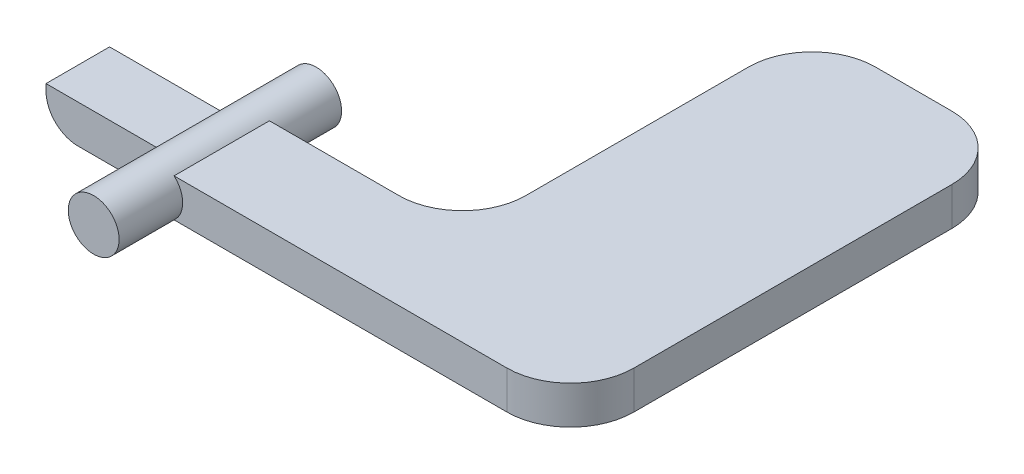
ISO-10303-21;
HEADER;
FILE_DESCRIPTION(('STEP AP214'),'2;1');
FILE_NAME('part.step','',(''),(''),'','','');
FILE_SCHEMA(('AUTOMOTIVE_DESIGN { 1 0 10303 214 1 1 1 1 }'));
ENDSEC;
DATA;
#1=APPLICATION_CONTEXT('core data for automotive mechanical design processes');
#2=APPLICATION_PROTOCOL_DEFINITION('international standard','automotive_design',2000,#1);
#3=PRODUCT_CONTEXT('',#1,'mechanical');
#4=PRODUCT('Part','Part','',(#3));
#5=PRODUCT_RELATED_PRODUCT_CATEGORY('part','',(#4));
#6=PRODUCT_DEFINITION_FORMATION('','',#4);
#7=PRODUCT_DEFINITION_CONTEXT('part definition',#1,'design');
#8=PRODUCT_DEFINITION('design','',#6,#7);
#9=PRODUCT_DEFINITION_SHAPE('','',#8);
#10=(LENGTH_UNIT() NAMED_UNIT(*) SI_UNIT(.MILLI.,.METRE.));
#11=(NAMED_UNIT(*) PLANE_ANGLE_UNIT() SI_UNIT($,.RADIAN.));
#12=(NAMED_UNIT(*) SI_UNIT($,.STERADIAN.) SOLID_ANGLE_UNIT());
#13=UNCERTAINTY_MEASURE_WITH_UNIT(LENGTH_MEASURE(1.E-05),#10,'distance_accuracy_value','');
#14=(GEOMETRIC_REPRESENTATION_CONTEXT(3) GLOBAL_UNCERTAINTY_ASSIGNED_CONTEXT((#13)) GLOBAL_UNIT_ASSIGNED_CONTEXT((#10,
#11,#12)) REPRESENTATION_CONTEXT('',''));
#15=CARTESIAN_POINT('',(0.,0.,0.));
#16=DIRECTION('',(0.,0.,1.));
#17=DIRECTION('',(1.,0.,0.));
#18=AXIS2_PLACEMENT_3D('',#15,#16,#17);
#19=CARTESIAN_POINT('',(-15.,2.,-5.00000000000001));
#20=DIRECTION('',(0.,0.,-1.));
#21=DIRECTION('',(-1.,0.,0.));
#22=AXIS2_PLACEMENT_3D('',#19,#20,#21);
#23=CYLINDRICAL_SURFACE('',#22,5.);
#24=DIRECTION('',(0.,0.,1.));
#25=VECTOR('',#24,1.);
#26=CARTESIAN_POINT('',(-20.,2.,-5.00000000000001));
#27=LINE('',#26,#25);
#28=CARTESIAN_POINT('',(-20.,2.,-5.00000000000001));
#29=VERTEX_POINT('',#28);
#30=CARTESIAN_POINT('',(-20.,2.,4.99999999999999));
#31=VERTEX_POINT('',#30);
#32=EDGE_CURVE('E210',#29,#31,#27,.T.);
#33=ORIENTED_EDGE('',*,*,#32,.F.);
#34=CARTESIAN_POINT('',(-15.,2.,-5.00000000000001));
#35=DIRECTION('',(0.,0.,1.));
#36=DIRECTION('',(1.,0.,0.));
#37=AXIS2_PLACEMENT_3D('',#34,#35,#36);
#38=CIRCLE('',#37,5.);
#39=CARTESIAN_POINT('',(-15.,-3.,-5.00000000000001));
#40=VERTEX_POINT('',#39);
#41=EDGE_CURVE('E43',#40,#29,#38,.F.);
#42=ORIENTED_EDGE('',*,*,#41,.F.);
#43=DIRECTION('',(0.,0.,1.));
#44=VECTOR('',#43,1.);
#45=CARTESIAN_POINT('',(-15.,-3.,-5.00000000000001));
#46=LINE('',#45,#44);
#47=CARTESIAN_POINT('',(-15.,-3.,4.99999999999999));
#48=VERTEX_POINT('',#47);
#49=EDGE_CURVE('E146',#48,#40,#46,.F.);
#50=ORIENTED_EDGE('',*,*,#49,.F.);
#51=CARTESIAN_POINT('',(-15.,2.,4.99999999999999));
#52=DIRECTION('',(0.,0.,-1.));
#53=DIRECTION('',(-1.,0.,0.));
#54=AXIS2_PLACEMENT_3D('',#51,#52,#53);
#55=CIRCLE('',#54,5.);
#56=EDGE_CURVE('E11',#31,#48,#55,.F.);
#57=ORIENTED_EDGE('',*,*,#56,.F.);
#58=EDGE_LOOP('',(#33,#42,#50,#57));
#59=FACE_BOUND('',#58,.T.);
#60=ADVANCED_FACE('F36',(#59),#23,.T.);
#61=CARTESIAN_POINT('',(0.,3.,0.));
#62=DIRECTION('',(0.,-1.,0.));
#63=DIRECTION('',(0.,0.,-1.));
#64=AXIS2_PLACEMENT_3D('',#61,#62,#63);
#65=PLANE('',#64);
#66=DIRECTION('',(-1.,0.,0.));
#67=VECTOR('',#66,1.);
#68=CARTESIAN_POINT('',(65.,3.,-62.5));
#69=LINE('',#68,#67);
#70=CARTESIAN_POINT('',(55.,3.,-62.5));
#71=VERTEX_POINT('',#70);
#72=CARTESIAN_POINT('',(43.,3.,-62.5));
#73=VERTEX_POINT('',#72);
#74=EDGE_CURVE('E234',#71,#73,#69,.T.);
#75=ORIENTED_EDGE('',*,*,#74,.T.);
#76=CARTESIAN_POINT('',(43.,3.,-52.5));
#77=DIRECTION('',(0.,-1.,0.));
#78=DIRECTION('',(0.,0.,-1.));
#79=AXIS2_PLACEMENT_3D('',#76,#77,#78);
#80=CIRCLE('',#79,10.);
#81=CARTESIAN_POINT('',(33.,3.,-52.5));
#82=VERTEX_POINT('',#81);
#83=EDGE_CURVE('E197',#73,#82,#80,.F.);
#84=ORIENTED_EDGE('',*,*,#83,.T.);
#85=DIRECTION('',(0.,0.,1.));
#86=VECTOR('',#85,1.);
#87=CARTESIAN_POINT('',(33.,3.,-62.5));
#88=LINE('',#87,#86);
#89=CARTESIAN_POINT('',(33.,3.,-17.5));
#90=VERTEX_POINT('',#89);
#91=EDGE_CURVE('E237',#82,#90,#88,.T.);
#92=ORIENTED_EDGE('',*,*,#91,.T.);
#93=CARTESIAN_POINT('',(23.,3.,-17.5));
#94=DIRECTION('',(0.,-1.,0.));
#95=DIRECTION('',(0.,0.,-1.));
#96=AXIS2_PLACEMENT_3D('',#93,#94,#95);
#97=CIRCLE('',#96,10.);
#98=CARTESIAN_POINT('',(23.,3.,-7.5));
#99=VERTEX_POINT('',#98);
#100=EDGE_CURVE('E208',#90,#99,#97,.T.);
#101=ORIENTED_EDGE('',*,*,#100,.T.);
#102=DIRECTION('',(-1.,0.,0.));
#103=VECTOR('',#102,1.);
#104=CARTESIAN_POINT('',(33.,3.,-7.5));
#105=LINE('',#104,#103);
#106=CARTESIAN_POINT('',(2.64575131106459,3.,-7.5));
#107=VERTEX_POINT('',#106);
#108=EDGE_CURVE('E240',#99,#107,#105,.T.);
#109=ORIENTED_EDGE('',*,*,#108,.T.);
#110=DIRECTION('',(0.,0.,1.));
#111=VECTOR('',#110,1.);
#112=CARTESIAN_POINT('',(2.64575131106459,3.,-17.5));
#113=LINE('',#112,#111);
#114=CARTESIAN_POINT('',(2.64575131106459,3.,7.5));
#115=VERTEX_POINT('',#114);
#116=EDGE_CURVE('E149',#107,#115,#113,.T.);
#117=ORIENTED_EDGE('',*,*,#116,.T.);
#118=DIRECTION('',(1.,0.,0.));
#119=VECTOR('',#118,1.);
#120=CARTESIAN_POINT('',(0.,3.,7.5));
#121=LINE('',#120,#119);
#122=CARTESIAN_POINT('',(55.,3.,7.5));
#123=VERTEX_POINT('',#122);
#124=EDGE_CURVE('E223',#115,#123,#121,.T.);
#125=ORIENTED_EDGE('',*,*,#124,.T.);
#126=CARTESIAN_POINT('',(55.,3.,-2.5));
#127=DIRECTION('',(0.,-1.,0.));
#128=DIRECTION('',(0.,0.,-1.));
#129=AXIS2_PLACEMENT_3D('',#126,#127,#128);
#130=CIRCLE('',#129,10.);
#131=CARTESIAN_POINT('',(65.,3.,-2.5));
#132=VERTEX_POINT('',#131);
#133=EDGE_CURVE('E193',#123,#132,#130,.F.);
#134=ORIENTED_EDGE('',*,*,#133,.T.);
#135=DIRECTION('',(0.,0.,-1.));
#136=VECTOR('',#135,1.);
#137=CARTESIAN_POINT('',(65.,3.,7.5));
#138=LINE('',#137,#136);
#139=CARTESIAN_POINT('',(65.,3.,-52.5));
#140=VERTEX_POINT('',#139);
#141=EDGE_CURVE('E231',#132,#140,#138,.T.);
#142=ORIENTED_EDGE('',*,*,#141,.T.);
#143=CARTESIAN_POINT('',(55.,3.,-52.5));
#144=DIRECTION('',(0.,-1.,0.));
#145=DIRECTION('',(0.,0.,-1.));
#146=AXIS2_PLACEMENT_3D('',#143,#144,#145);
#147=CIRCLE('',#146,10.);
#148=EDGE_CURVE('E195',#140,#71,#147,.F.);
#149=ORIENTED_EDGE('',*,*,#148,.T.);
#150=EDGE_LOOP('',(#75,#84,#92,#101,#109,#117,#125,#134,#142,#149));
#151=FACE_BOUND('',#150,.T.);
#152=ADVANCED_FACE('F268',(#151),#65,.F.);
#153=CARTESIAN_POINT('',(0.,-3.,0.));
#154=DIRECTION('',(0.,-1.,0.));
#155=DIRECTION('',(0.,0.,-1.));
#156=AXIS2_PLACEMENT_3D('',#153,#154,#155);
#157=PLANE('',#156);
#158=DIRECTION('',(0.,0.,1.));
#159=VECTOR('',#158,1.);
#160=CARTESIAN_POINT('',(33.,-3.,-62.5));
#161=LINE('',#160,#159);
#162=CARTESIAN_POINT('',(33.,-3.,-52.5));
#163=VERTEX_POINT('',#162);
#164=CARTESIAN_POINT('',(33.,-3.,-17.5));
#165=VERTEX_POINT('',#164);
#166=EDGE_CURVE('E252',#163,#165,#161,.T.);
#167=ORIENTED_EDGE('',*,*,#166,.F.);
#168=CARTESIAN_POINT('',(43.,-3.,-52.5));
#169=DIRECTION('',(0.,-1.,0.));
#170=DIRECTION('',(0.,0.,-1.));
#171=AXIS2_PLACEMENT_3D('',#168,#169,#170);
#172=CIRCLE('',#171,10.);
#173=CARTESIAN_POINT('',(43.,-3.,-62.5));
#174=VERTEX_POINT('',#173);
#175=EDGE_CURVE('E186',#163,#174,#172,.T.);
#176=ORIENTED_EDGE('',*,*,#175,.T.);
#177=DIRECTION('',(-1.,0.,0.));
#178=VECTOR('',#177,1.);
#179=CARTESIAN_POINT('',(65.,-3.,-62.5));
#180=LINE('',#179,#178);
#181=CARTESIAN_POINT('',(55.,-3.,-62.5));
#182=VERTEX_POINT('',#181);
#183=EDGE_CURVE('E249',#182,#174,#180,.T.);
#184=ORIENTED_EDGE('',*,*,#183,.F.);
#185=CARTESIAN_POINT('',(55.,-3.,-52.5));
#186=DIRECTION('',(0.,-1.,0.));
#187=DIRECTION('',(0.,0.,-1.));
#188=AXIS2_PLACEMENT_3D('',#185,#186,#187);
#189=CIRCLE('',#188,10.);
#190=CARTESIAN_POINT('',(65.,-3.,-52.5));
#191=VERTEX_POINT('',#190);
#192=EDGE_CURVE('E184',#182,#191,#189,.T.);
#193=ORIENTED_EDGE('',*,*,#192,.T.);
#194=DIRECTION('',(0.,0.,-1.));
#195=VECTOR('',#194,1.);
#196=CARTESIAN_POINT('',(65.,-3.,7.5));
#197=LINE('',#196,#195);
#198=CARTESIAN_POINT('',(65.,-3.,-2.5));
#199=VERTEX_POINT('',#198);
#200=EDGE_CURVE('E246',#199,#191,#197,.T.);
#201=ORIENTED_EDGE('',*,*,#200,.F.);
#202=CARTESIAN_POINT('',(55.,-3.,-2.5));
#203=DIRECTION('',(0.,-1.,0.));
#204=DIRECTION('',(0.,0.,-1.));
#205=AXIS2_PLACEMENT_3D('',#202,#203,#204);
#206=CIRCLE('',#205,10.);
#207=CARTESIAN_POINT('',(55.,-3.,7.5));
#208=VERTEX_POINT('',#207);
#209=EDGE_CURVE('E182',#199,#208,#206,.T.);
#210=ORIENTED_EDGE('',*,*,#209,.T.);
#211=DIRECTION('',(1.,0.,0.));
#212=VECTOR('',#211,1.);
#213=CARTESIAN_POINT('',(0.,-3.,7.5));
#214=LINE('',#213,#212);
#215=CARTESIAN_POINT('',(2.64575131106459,-3.,7.5));
#216=VERTEX_POINT('',#215);
#217=EDGE_CURVE('E243',#216,#208,#214,.T.);
#218=ORIENTED_EDGE('',*,*,#217,.F.);
#219=DIRECTION('',(0.,0.,1.));
#220=VECTOR('',#219,1.);
#221=CARTESIAN_POINT('',(2.64575131106459,-3.,-17.5));
#222=LINE('',#221,#220);
#223=CARTESIAN_POINT('',(2.64575131106459,-3.,-7.5));
#224=VERTEX_POINT('',#223);
#225=EDGE_CURVE('E164',#224,#216,#222,.T.);
#226=ORIENTED_EDGE('',*,*,#225,.F.);
#227=DIRECTION('',(-1.,0.,0.));
#228=VECTOR('',#227,1.);
#229=CARTESIAN_POINT('',(33.,-3.,-7.5));
#230=LINE('',#229,#228);
#231=CARTESIAN_POINT('',(23.,-3.,-7.5));
#232=VERTEX_POINT('',#231);
#233=EDGE_CURVE('E225',#232,#224,#230,.T.);
#234=ORIENTED_EDGE('',*,*,#233,.F.);
#235=CARTESIAN_POINT('',(23.,-3.,-17.5));
#236=DIRECTION('',(0.,-1.,0.));
#237=DIRECTION('',(0.,0.,-1.));
#238=AXIS2_PLACEMENT_3D('',#235,#236,#237);
#239=CIRCLE('',#238,10.);
#240=EDGE_CURVE('E206',#232,#165,#239,.F.);
#241=ORIENTED_EDGE('',*,*,#240,.T.);
#242=EDGE_LOOP('',(#167,#176,#184,#193,#201,#210,#218,#226,#234,#241));
#243=FACE_BOUND('',#242,.T.);
#244=ADVANCED_FACE('F281',(#243),#157,.T.);
#245=CARTESIAN_POINT('',(0.,3.,7.5));
#246=DIRECTION('',(0.,0.,-1.));
#247=DIRECTION('',(-1.,0.,0.));
#248=AXIS2_PLACEMENT_3D('',#245,#246,#247);
#249=PLANE('',#248);
#250=ORIENTED_EDGE('',*,*,#217,.T.);
#251=DIRECTION('',(0.,-1.,0.));
#252=VECTOR('',#251,1.);
#253=CARTESIAN_POINT('',(55.,3.,7.5));
#254=LINE('',#253,#252);
#255=EDGE_CURVE('E204',#208,#123,#254,.F.);
#256=ORIENTED_EDGE('',*,*,#255,.T.);
#257=ORIENTED_EDGE('',*,*,#124,.F.);
#258=CARTESIAN_POINT('',(0.,0.,7.5));
#259=DIRECTION('',(0.,0.,-1.));
#260=DIRECTION('',(-1.,0.,0.));
#261=AXIS2_PLACEMENT_3D('',#258,#259,#260);
#262=CIRCLE('',#261,4.);
#263=EDGE_CURVE('E260',#115,#216,#262,.T.);
#264=ORIENTED_EDGE('',*,*,#263,.T.);
#265=EDGE_LOOP('',(#250,#256,#257,#264));
#266=FACE_BOUND('',#265,.T.);
#267=ADVANCED_FACE('F275',(#266),#249,.F.);
#268=CARTESIAN_POINT('',(65.,3.,7.5));
#269=DIRECTION('',(-1.,0.,0.));
#270=DIRECTION('',(0.,0.,1.));
#271=AXIS2_PLACEMENT_3D('',#268,#269,#270);
#272=PLANE('',#271);
#273=ORIENTED_EDGE('',*,*,#200,.T.);
#274=DIRECTION('',(0.,-1.,0.));
#275=VECTOR('',#274,1.);
#276=CARTESIAN_POINT('',(65.,3.,-52.5));
#277=LINE('',#276,#275);
#278=EDGE_CURVE('E202',#191,#140,#277,.F.);
#279=ORIENTED_EDGE('',*,*,#278,.T.);
#280=ORIENTED_EDGE('',*,*,#141,.F.);
#281=DIRECTION('',(0.,-1.,0.));
#282=VECTOR('',#281,1.);
#283=CARTESIAN_POINT('',(65.,3.,-2.5));
#284=LINE('',#283,#282);
#285=EDGE_CURVE('E199',#132,#199,#284,.T.);
#286=ORIENTED_EDGE('',*,*,#285,.T.);
#287=EDGE_LOOP('',(#273,#279,#280,#286));
#288=FACE_BOUND('',#287,.T.);
#289=ADVANCED_FACE('F289',(#288),#272,.F.);
#290=CARTESIAN_POINT('',(65.,3.,-62.5));
#291=DIRECTION('',(0.,0.,1.));
#292=DIRECTION('',(1.,0.,0.));
#293=AXIS2_PLACEMENT_3D('',#290,#291,#292);
#294=PLANE('',#293);
#295=ORIENTED_EDGE('',*,*,#183,.T.);
#296=DIRECTION('',(0.,-1.,0.));
#297=VECTOR('',#296,1.);
#298=CARTESIAN_POINT('',(43.,3.,-62.5));
#299=LINE('',#298,#297);
#300=EDGE_CURVE('E191',#174,#73,#299,.F.);
#301=ORIENTED_EDGE('',*,*,#300,.T.);
#302=ORIENTED_EDGE('',*,*,#74,.F.);
#303=DIRECTION('',(0.,-1.,0.));
#304=VECTOR('',#303,1.);
#305=CARTESIAN_POINT('',(55.,3.,-62.5));
#306=LINE('',#305,#304);
#307=EDGE_CURVE('E188',#71,#182,#306,.T.);
#308=ORIENTED_EDGE('',*,*,#307,.T.);
#309=EDGE_LOOP('',(#295,#301,#302,#308));
#310=FACE_BOUND('',#309,.T.);
#311=ADVANCED_FACE('F297',(#310),#294,.F.);
#312=CARTESIAN_POINT('',(33.,3.,-62.5));
#313=DIRECTION('',(1.,0.,0.));
#314=DIRECTION('',(0.,0.,-1.));
#315=AXIS2_PLACEMENT_3D('',#312,#313,#314);
#316=PLANE('',#315);
#317=ORIENTED_EDGE('',*,*,#166,.T.);
#318=DIRECTION('',(0.,-1.,0.));
#319=VECTOR('',#318,1.);
#320=CARTESIAN_POINT('',(33.,3.,-17.5));
#321=LINE('',#320,#319);
#322=EDGE_CURVE('E180',#165,#90,#321,.F.);
#323=ORIENTED_EDGE('',*,*,#322,.T.);
#324=ORIENTED_EDGE('',*,*,#91,.F.);
#325=DIRECTION('',(0.,-1.,0.));
#326=VECTOR('',#325,1.);
#327=CARTESIAN_POINT('',(33.,3.,-52.5));
#328=LINE('',#327,#326);
#329=EDGE_CURVE('E177',#82,#163,#328,.T.);
#330=ORIENTED_EDGE('',*,*,#329,.T.);
#331=EDGE_LOOP('',(#317,#323,#324,#330));
#332=FACE_BOUND('',#331,.T.);
#333=ADVANCED_FACE('F306',(#332),#316,.F.);
#334=CARTESIAN_POINT('',(33.,3.,-7.5));
#335=DIRECTION('',(0.,0.,1.));
#336=DIRECTION('',(1.,0.,0.));
#337=AXIS2_PLACEMENT_3D('',#334,#335,#336);
#338=PLANE('',#337);
#339=ORIENTED_EDGE('',*,*,#108,.F.);
#340=DIRECTION('',(0.,-1.,0.));
#341=VECTOR('',#340,1.);
#342=CARTESIAN_POINT('',(23.,-3.,-7.5));
#343=LINE('',#342,#341);
#344=EDGE_CURVE('E168',#99,#232,#343,.T.);
#345=ORIENTED_EDGE('',*,*,#344,.T.);
#346=ORIENTED_EDGE('',*,*,#233,.T.);
#347=CARTESIAN_POINT('',(0.,0.,-7.5));
#348=DIRECTION('',(0.,0.,1.));
#349=DIRECTION('',(1.,0.,0.));
#350=AXIS2_PLACEMENT_3D('',#347,#348,#349);
#351=CIRCLE('',#350,4.);
#352=EDGE_CURVE('E257',#224,#107,#351,.T.);
#353=ORIENTED_EDGE('',*,*,#352,.T.);
#354=EDGE_LOOP('',(#339,#345,#346,#353));
#355=FACE_BOUND('',#354,.T.);
#356=ADVANCED_FACE('F312',(#355),#338,.F.);
#357=CARTESIAN_POINT('',(0.,0.,-17.5));
#358=DIRECTION('',(0.,0.,1.));
#359=DIRECTION('',(1.,0.,0.));
#360=AXIS2_PLACEMENT_3D('',#357,#358,#359);
#361=CYLINDRICAL_SURFACE('',#360,4.);
#362=DIRECTION('',(0.,0.,1.));
#363=VECTOR('',#362,1.);
#364=CARTESIAN_POINT('',(-2.64575131106459,3.,-17.5));
#365=LINE('',#364,#363);
#366=CARTESIAN_POINT('',(-2.64575131106459,3.,4.99999999999999));
#367=VERTEX_POINT('',#366);
#368=CARTESIAN_POINT('',(-2.64575131106459,3.,-5.00000000000001));
#369=VERTEX_POINT('',#368);
#370=EDGE_CURVE('E159',#367,#369,#365,.F.);
#371=ORIENTED_EDGE('',*,*,#370,.F.);
#372=CARTESIAN_POINT('',(0.,0.,4.99999999999999));
#373=DIRECTION('',(0.,0.,-1.));
#374=DIRECTION('',(-1.,0.,0.));
#375=AXIS2_PLACEMENT_3D('',#372,#373,#374);
#376=CIRCLE('',#375,4.);
#377=CARTESIAN_POINT('',(-2.64575131106459,-3.,4.99999999999999));
#378=VERTEX_POINT('',#377);
#379=EDGE_CURVE('E160',#378,#367,#376,.T.);
#380=ORIENTED_EDGE('',*,*,#379,.F.);
#381=DIRECTION('',(0.,0.,1.));
#382=VECTOR('',#381,1.);
#383=CARTESIAN_POINT('',(-2.64575131106459,-3.,-17.5));
#384=LINE('',#383,#382);
#385=CARTESIAN_POINT('',(-2.64575131106459,-3.,-5.00000000000001));
#386=VERTEX_POINT('',#385);
#387=EDGE_CURVE('E144',#378,#386,#384,.F.);
#388=ORIENTED_EDGE('',*,*,#387,.T.);
#389=CARTESIAN_POINT('',(0.,0.,-5.00000000000001));
#390=DIRECTION('',(0.,0.,1.));
#391=DIRECTION('',(1.,0.,0.));
#392=AXIS2_PLACEMENT_3D('',#389,#390,#391);
#393=CIRCLE('',#392,4.);
#394=EDGE_CURVE('E153',#369,#386,#393,.T.);
#395=ORIENTED_EDGE('',*,*,#394,.F.);
#396=EDGE_LOOP('',(#371,#380,#388,#395));
#397=FACE_BOUND('',#396,.T.);
#398=CARTESIAN_POINT('',(0.,0.,-17.5));
#399=DIRECTION('',(0.,0.,1.));
#400=DIRECTION('',(1.,0.,0.));
#401=AXIS2_PLACEMENT_3D('',#398,#399,#400);
#402=CIRCLE('',#401,4.);
#403=CARTESIAN_POINT('',(4.,0.,-17.5));
#404=VERTEX_POINT('',#403);
#405=EDGE_CURVE('E515',#404,#404,#402,.T.);
#406=ORIENTED_EDGE('',*,*,#405,.T.);
#407=EDGE_LOOP('',(#406));
#408=FACE_BOUND('',#407,.T.);
#409=CARTESIAN_POINT('',(0.,0.,17.5));
#410=DIRECTION('',(0.,0.,1.));
#411=DIRECTION('',(1.,0.,0.));
#412=AXIS2_PLACEMENT_3D('',#409,#410,#411);
#413=CIRCLE('',#412,4.);
#414=CARTESIAN_POINT('',(4.,0.,17.5));
#415=VERTEX_POINT('',#414);
#416=EDGE_CURVE('E516',#415,#415,#413,.T.);
#417=ORIENTED_EDGE('',*,*,#416,.F.);
#418=EDGE_LOOP('',(#417));
#419=FACE_BOUND('',#418,.T.);
#420=ORIENTED_EDGE('',*,*,#116,.F.);
#421=ORIENTED_EDGE('',*,*,#352,.F.);
#422=ORIENTED_EDGE('',*,*,#225,.T.);
#423=ORIENTED_EDGE('',*,*,#263,.F.);
#424=EDGE_LOOP('',(#420,#421,#422,#423));
#425=FACE_BOUND('',#424,.T.);
#426=ADVANCED_FACE('F162',(#397,#408,#419,#425),#361,.T.);
#427=CARTESIAN_POINT('',(0.,0.,-17.5));
#428=DIRECTION('',(0.,0.,1.));
#429=DIRECTION('',(1.,0.,0.));
#430=AXIS2_PLACEMENT_3D('',#427,#428,#429);
#431=PLANE('',#430);
#432=ORIENTED_EDGE('',*,*,#405,.F.);
#433=EDGE_LOOP('',(#432));
#434=FACE_BOUND('',#433,.T.);
#435=ADVANCED_FACE('F319',(#434),#431,.F.);
#436=CARTESIAN_POINT('',(0.,0.,17.5));
#437=DIRECTION('',(0.,0.,1.));
#438=DIRECTION('',(1.,0.,0.));
#439=AXIS2_PLACEMENT_3D('',#436,#437,#438);
#440=PLANE('',#439);
#441=ORIENTED_EDGE('',*,*,#416,.T.);
#442=EDGE_LOOP('',(#441));
#443=FACE_BOUND('',#442,.T.);
#444=ADVANCED_FACE('F339',(#443),#440,.T.);
#445=CARTESIAN_POINT('',(-20.,3.,-5.00000000000001));
#446=DIRECTION('',(1.,0.,0.));
#447=DIRECTION('',(0.,0.,-1.));
#448=AXIS2_PLACEMENT_3D('',#445,#446,#447);
#449=PLANE('',#448);
#450=DIRECTION('',(0.,-1.,0.));
#451=VECTOR('',#450,1.);
#452=CARTESIAN_POINT('',(-20.,3.,-5.00000000000001));
#453=LINE('',#452,#451);
#454=CARTESIAN_POINT('',(-20.,3.,-5.00000000000001));
#455=VERTEX_POINT('',#454);
#456=EDGE_CURVE('E165',#455,#29,#453,.T.);
#457=ORIENTED_EDGE('',*,*,#456,.T.);
#458=ORIENTED_EDGE('',*,*,#32,.T.);
#459=DIRECTION('',(0.,-1.,0.));
#460=VECTOR('',#459,1.);
#461=CARTESIAN_POINT('',(-20.,3.,4.99999999999999));
#462=LINE('',#461,#460);
#463=CARTESIAN_POINT('',(-20.,3.,4.99999999999999));
#464=VERTEX_POINT('',#463);
#465=EDGE_CURVE('E171',#464,#31,#462,.T.);
#466=ORIENTED_EDGE('',*,*,#465,.F.);
#467=DIRECTION('',(0.,0.,1.));
#468=VECTOR('',#467,1.);
#469=CARTESIAN_POINT('',(-20.,3.,-5.00000000000001));
#470=LINE('',#469,#468);
#471=EDGE_CURVE('E217',#455,#464,#470,.T.);
#472=ORIENTED_EDGE('',*,*,#471,.F.);
#473=EDGE_LOOP('',(#457,#458,#466,#472));
#474=FACE_BOUND('',#473,.T.);
#475=ADVANCED_FACE('F216',(#474),#449,.F.);
#476=DIRECTION('',(1.,0.,0.));
#477=VECTOR('',#476,1.);
#478=CARTESIAN_POINT('',(-20.,3.,4.99999999999999));
#479=LINE('',#478,#477);
#480=EDGE_CURVE('E221',#464,#367,#479,.T.);
#481=ORIENTED_EDGE('',*,*,#480,.T.);
#482=ORIENTED_EDGE('',*,*,#370,.T.);
#483=DIRECTION('',(-1.,0.,0.));
#484=VECTOR('',#483,1.);
#485=CARTESIAN_POINT('',(0.,3.,-5.00000000000001));
#486=LINE('',#485,#484);
#487=EDGE_CURVE('E156',#369,#455,#486,.T.);
#488=ORIENTED_EDGE('',*,*,#487,.T.);
#489=ORIENTED_EDGE('',*,*,#471,.T.);
#490=EDGE_LOOP('',(#481,#482,#488,#489));
#491=FACE_BOUND('',#490,.T.);
#492=ADVANCED_FACE('F256',(#491),#65,.F.);
#493=DIRECTION('',(1.,0.,0.));
#494=VECTOR('',#493,1.);
#495=CARTESIAN_POINT('',(-20.,-3.,4.99999999999999));
#496=LINE('',#495,#494);
#497=EDGE_CURVE('E148',#48,#378,#496,.T.);
#498=ORIENTED_EDGE('',*,*,#497,.F.);
#499=ORIENTED_EDGE('',*,*,#49,.T.);
#500=DIRECTION('',(-1.,0.,0.));
#501=VECTOR('',#500,1.);
#502=CARTESIAN_POINT('',(0.,-3.,-5.00000000000001));
#503=LINE('',#502,#501);
#504=EDGE_CURVE('E139',#386,#40,#503,.T.);
#505=ORIENTED_EDGE('',*,*,#504,.F.);
#506=ORIENTED_EDGE('',*,*,#387,.F.);
#507=EDGE_LOOP('',(#498,#499,#505,#506));
#508=FACE_BOUND('',#507,.T.);
#509=ADVANCED_FACE('F142',(#508),#157,.T.);
#510=CARTESIAN_POINT('',(-20.,3.,4.99999999999999));
#511=DIRECTION('',(0.,0.,-1.));
#512=DIRECTION('',(-1.,0.,0.));
#513=AXIS2_PLACEMENT_3D('',#510,#511,#512);
#514=PLANE('',#513);
#515=ORIENTED_EDGE('',*,*,#465,.T.);
#516=ORIENTED_EDGE('',*,*,#56,.T.);
#517=ORIENTED_EDGE('',*,*,#497,.T.);
#518=ORIENTED_EDGE('',*,*,#379,.T.);
#519=ORIENTED_EDGE('',*,*,#480,.F.);
#520=EDGE_LOOP('',(#515,#516,#517,#518,#519));
#521=FACE_BOUND('',#520,.T.);
#522=ADVANCED_FACE('F255',(#521),#514,.F.);
#523=CARTESIAN_POINT('',(0.,3.,-5.00000000000001));
#524=DIRECTION('',(0.,0.,1.));
#525=DIRECTION('',(1.,0.,0.));
#526=AXIS2_PLACEMENT_3D('',#523,#524,#525);
#527=PLANE('',#526);
#528=ORIENTED_EDGE('',*,*,#504,.T.);
#529=ORIENTED_EDGE('',*,*,#41,.T.);
#530=ORIENTED_EDGE('',*,*,#456,.F.);
#531=ORIENTED_EDGE('',*,*,#487,.F.);
#532=ORIENTED_EDGE('',*,*,#394,.T.);
#533=EDGE_LOOP('',(#528,#529,#530,#531,#532));
#534=FACE_BOUND('',#533,.T.);
#535=ADVANCED_FACE('F154',(#534),#527,.F.);
#536=CARTESIAN_POINT('',(23.,3.,-17.5));
#537=DIRECTION('',(0.,1.,0.));
#538=DIRECTION('',(0.,0.,1.));
#539=AXIS2_PLACEMENT_3D('',#536,#537,#538);
#540=CYLINDRICAL_SURFACE('',#539,10.);
#541=ORIENTED_EDGE('',*,*,#100,.F.);
#542=ORIENTED_EDGE('',*,*,#322,.F.);
#543=ORIENTED_EDGE('',*,*,#240,.F.);
#544=ORIENTED_EDGE('',*,*,#344,.F.);
#545=EDGE_LOOP('',(#541,#542,#543,#544));
#546=FACE_BOUND('',#545,.T.);
#547=ADVANCED_FACE('F309',(#546),#540,.F.);
#548=CARTESIAN_POINT('',(43.,3.,-52.5));
#549=DIRECTION('',(0.,-1.,0.));
#550=DIRECTION('',(0.,0.,-1.));
#551=AXIS2_PLACEMENT_3D('',#548,#549,#550);
#552=CYLINDRICAL_SURFACE('',#551,10.);
#553=ORIENTED_EDGE('',*,*,#83,.F.);
#554=ORIENTED_EDGE('',*,*,#300,.F.);
#555=ORIENTED_EDGE('',*,*,#175,.F.);
#556=ORIENTED_EDGE('',*,*,#329,.F.);
#557=EDGE_LOOP('',(#553,#554,#555,#556));
#558=FACE_BOUND('',#557,.T.);
#559=ADVANCED_FACE('F301',(#558),#552,.T.);
#560=CARTESIAN_POINT('',(55.,3.,-52.5));
#561=DIRECTION('',(0.,-1.,0.));
#562=DIRECTION('',(0.,0.,-1.));
#563=AXIS2_PLACEMENT_3D('',#560,#561,#562);
#564=CYLINDRICAL_SURFACE('',#563,10.);
#565=ORIENTED_EDGE('',*,*,#148,.F.);
#566=ORIENTED_EDGE('',*,*,#278,.F.);
#567=ORIENTED_EDGE('',*,*,#192,.F.);
#568=ORIENTED_EDGE('',*,*,#307,.F.);
#569=EDGE_LOOP('',(#565,#566,#567,#568));
#570=FACE_BOUND('',#569,.T.);
#571=ADVANCED_FACE('F292',(#570),#564,.T.);
#572=CARTESIAN_POINT('',(55.,3.,-2.5));
#573=DIRECTION('',(0.,-1.,0.));
#574=DIRECTION('',(0.,0.,-1.));
#575=AXIS2_PLACEMENT_3D('',#572,#573,#574);
#576=CYLINDRICAL_SURFACE('',#575,10.);
#577=ORIENTED_EDGE('',*,*,#133,.F.);
#578=ORIENTED_EDGE('',*,*,#255,.F.);
#579=ORIENTED_EDGE('',*,*,#209,.F.);
#580=ORIENTED_EDGE('',*,*,#285,.F.);
#581=EDGE_LOOP('',(#577,#578,#579,#580));
#582=FACE_BOUND('',#581,.T.);
#583=ADVANCED_FACE('F284',(#582),#576,.T.);
#584=CLOSED_SHELL('',(#60,#152,#244,#267,#289,#311,#333,#356,#426,#435,#444,#475,#492,#509,#522,
#535,#547,#559,#571,#583));
#585=MANIFOLD_SOLID_BREP('B2',#584);
#586=ADVANCED_BREP_SHAPE_REPRESENTATION('',(#18,#585),#14);
#587=SHAPE_DEFINITION_REPRESENTATION(#9,#586);
ENDSEC;
END-ISO-10303-21;
